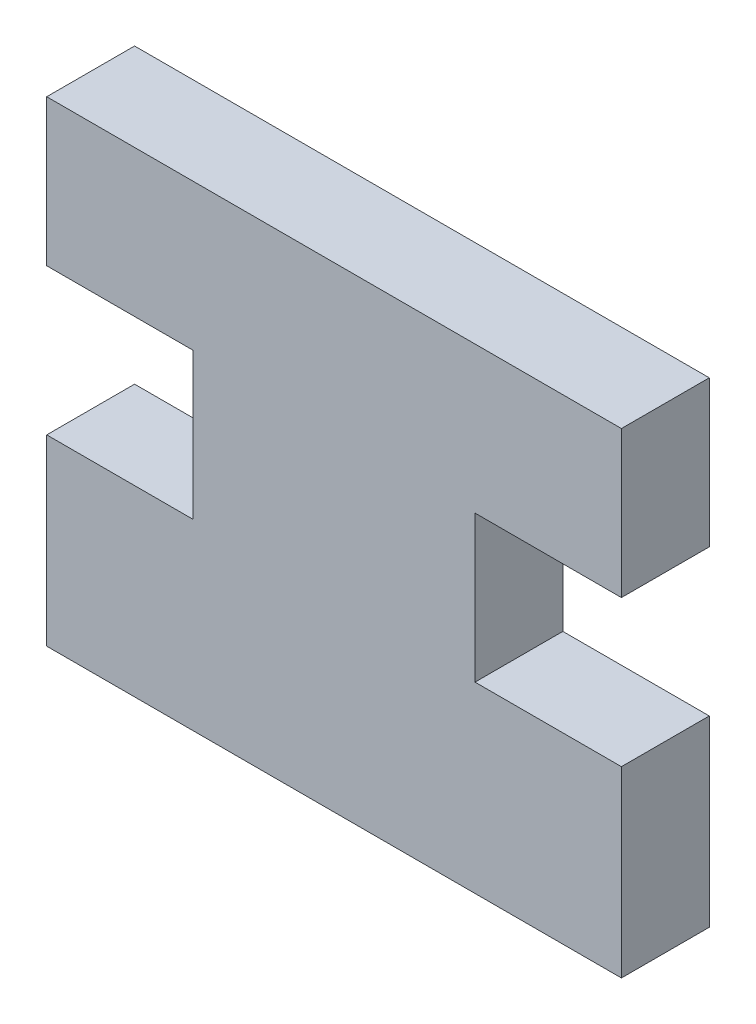
ISO-10303-21;
HEADER;
FILE_DESCRIPTION(('STEP AP214'),'2;1');
FILE_NAME('part.step','',(''),(''),'','','');
FILE_SCHEMA(('AUTOMOTIVE_DESIGN { 1 0 10303 214 1 1 1 1 }'));
ENDSEC;
DATA;
#1=APPLICATION_CONTEXT('core data for automotive mechanical design processes');
#2=APPLICATION_PROTOCOL_DEFINITION('international standard','automotive_design',2000,#1);
#3=PRODUCT_CONTEXT('',#1,'mechanical');
#4=PRODUCT('Part','Part','',(#3));
#5=PRODUCT_RELATED_PRODUCT_CATEGORY('part','',(#4));
#6=PRODUCT_DEFINITION_FORMATION('','',#4);
#7=PRODUCT_DEFINITION_CONTEXT('part definition',#1,'design');
#8=PRODUCT_DEFINITION('design','',#6,#7);
#9=PRODUCT_DEFINITION_SHAPE('','',#8);
#10=(LENGTH_UNIT() NAMED_UNIT(*) SI_UNIT(.MILLI.,.METRE.));
#11=(NAMED_UNIT(*) PLANE_ANGLE_UNIT() SI_UNIT($,.RADIAN.));
#12=(NAMED_UNIT(*) SI_UNIT($,.STERADIAN.) SOLID_ANGLE_UNIT());
#13=UNCERTAINTY_MEASURE_WITH_UNIT(LENGTH_MEASURE(1.E-05),#10,'distance_accuracy_value','');
#14=(GEOMETRIC_REPRESENTATION_CONTEXT(3) GLOBAL_UNCERTAINTY_ASSIGNED_CONTEXT((#13)) GLOBAL_UNIT_ASSIGNED_CONTEXT((#10,
#11,#12)) REPRESENTATION_CONTEXT('',''));
#15=CARTESIAN_POINT('',(0.,0.,0.));
#16=DIRECTION('',(0.,0.,1.));
#17=DIRECTION('',(1.,0.,0.));
#18=AXIS2_PLACEMENT_3D('',#15,#16,#17);
#19=CARTESIAN_POINT('',(1.57,0.,0.24));
#20=DIRECTION('',(0.,1.,0.));
#21=DIRECTION('',(-1.,0.,0.));
#22=AXIS2_PLACEMENT_3D('',#19,#20,#21);
#23=PLANE('',#22);
#24=DIRECTION('',(1.,0.,0.));
#25=VECTOR('',#24,1.);
#26=CARTESIAN_POINT('',(1.57,0.,0.));
#27=LINE('',#26,#25);
#28=CARTESIAN_POINT('',(0.,0.,0.));
#29=VERTEX_POINT('',#28);
#30=CARTESIAN_POINT('',(1.57,0.,0.));
#31=VERTEX_POINT('',#30);
#32=EDGE_CURVE('E163',#29,#31,#27,.T.);
#33=ORIENTED_EDGE('',*,*,#32,.T.);
#34=DIRECTION('',(0.,0.,-1.));
#35=VECTOR('',#34,1.);
#36=CARTESIAN_POINT('',(1.57,0.,0.24));
#37=LINE('',#36,#35);
#38=CARTESIAN_POINT('',(1.57,0.,0.24));
#39=VERTEX_POINT('',#38);
#40=EDGE_CURVE('E11',#39,#31,#37,.T.);
#41=ORIENTED_EDGE('',*,*,#40,.F.);
#42=DIRECTION('',(1.,0.,0.));
#43=VECTOR('',#42,1.);
#44=CARTESIAN_POINT('',(1.57,0.,0.24));
#45=LINE('',#44,#43);
#46=CARTESIAN_POINT('',(0.,0.,0.24));
#47=VERTEX_POINT('',#46);
#48=EDGE_CURVE('E197',#47,#39,#45,.T.);
#49=ORIENTED_EDGE('',*,*,#48,.F.);
#50=DIRECTION('',(0.,0.,-1.));
#51=VECTOR('',#50,1.);
#52=CARTESIAN_POINT('',(0.,0.,0.24));
#53=LINE('',#52,#51);
#54=EDGE_CURVE('E159',#47,#29,#53,.T.);
#55=ORIENTED_EDGE('',*,*,#54,.T.);
#56=EDGE_LOOP('',(#33,#41,#49,#55));
#57=FACE_BOUND('',#56,.T.);
#58=ADVANCED_FACE('F38',(#57),#23,.F.);
#59=CARTESIAN_POINT('',(1.57,0.5,0.24));
#60=DIRECTION('',(-1.,0.,0.));
#61=DIRECTION('',(0.,0.,1.));
#62=AXIS2_PLACEMENT_3D('',#59,#60,#61);
#63=PLANE('',#62);
#64=DIRECTION('',(0.,1.,0.));
#65=VECTOR('',#64,1.);
#66=CARTESIAN_POINT('',(1.57,0.5,0.));
#67=LINE('',#66,#65);
#68=CARTESIAN_POINT('',(1.57,0.5,0.));
#69=VERTEX_POINT('',#68);
#70=EDGE_CURVE('E167',#31,#69,#67,.T.);
#71=ORIENTED_EDGE('',*,*,#70,.T.);
#72=DIRECTION('',(0.,0.,-1.));
#73=VECTOR('',#72,1.);
#74=CARTESIAN_POINT('',(1.57,0.5,0.24));
#75=LINE('',#74,#73);
#76=CARTESIAN_POINT('',(1.57,0.5,0.24));
#77=VERTEX_POINT('',#76);
#78=EDGE_CURVE('E47',#77,#69,#75,.T.);
#79=ORIENTED_EDGE('',*,*,#78,.F.);
#80=DIRECTION('',(0.,1.,0.));
#81=VECTOR('',#80,1.);
#82=CARTESIAN_POINT('',(1.57,0.5,0.24));
#83=LINE('',#82,#81);
#84=EDGE_CURVE('E110',#39,#77,#83,.T.);
#85=ORIENTED_EDGE('',*,*,#84,.F.);
#86=ORIENTED_EDGE('',*,*,#40,.T.);
#87=EDGE_LOOP('',(#71,#79,#85,#86));
#88=FACE_BOUND('',#87,.T.);
#89=ADVANCED_FACE('F291',(#88),#63,.F.);
#90=CARTESIAN_POINT('',(1.17,0.5,0.24));
#91=DIRECTION('',(0.,-1.,0.));
#92=DIRECTION('',(0.,0.,-1.));
#93=AXIS2_PLACEMENT_3D('',#90,#91,#92);
#94=PLANE('',#93);
#95=DIRECTION('',(-1.,0.,0.));
#96=VECTOR('',#95,1.);
#97=CARTESIAN_POINT('',(1.17,0.5,0.));
#98=LINE('',#97,#96);
#99=CARTESIAN_POINT('',(1.17,0.5,0.));
#100=VERTEX_POINT('',#99);
#101=EDGE_CURVE('E170',#69,#100,#98,.T.);
#102=ORIENTED_EDGE('',*,*,#101,.T.);
#103=DIRECTION('',(0.,0.,-1.));
#104=VECTOR('',#103,1.);
#105=CARTESIAN_POINT('',(1.17,0.5,0.24));
#106=LINE('',#105,#104);
#107=CARTESIAN_POINT('',(1.17,0.5,0.24));
#108=VERTEX_POINT('',#107);
#109=EDGE_CURVE('E224',#108,#100,#106,.T.);
#110=ORIENTED_EDGE('',*,*,#109,.F.);
#111=DIRECTION('',(-1.,0.,0.));
#112=VECTOR('',#111,1.);
#113=CARTESIAN_POINT('',(1.17,0.5,0.24));
#114=LINE('',#113,#112);
#115=EDGE_CURVE('E234',#77,#108,#114,.T.);
#116=ORIENTED_EDGE('',*,*,#115,.F.);
#117=ORIENTED_EDGE('',*,*,#78,.T.);
#118=EDGE_LOOP('',(#102,#110,#116,#117));
#119=FACE_BOUND('',#118,.T.);
#120=ADVANCED_FACE('F232',(#119),#94,.F.);
#121=CARTESIAN_POINT('',(1.17,0.9,0.24));
#122=DIRECTION('',(-1.,0.,0.));
#123=DIRECTION('',(0.,0.,1.));
#124=AXIS2_PLACEMENT_3D('',#121,#122,#123);
#125=PLANE('',#124);
#126=DIRECTION('',(0.,1.,0.));
#127=VECTOR('',#126,1.);
#128=CARTESIAN_POINT('',(1.17,0.9,0.));
#129=LINE('',#128,#127);
#130=CARTESIAN_POINT('',(1.17,0.9,0.));
#131=VERTEX_POINT('',#130);
#132=EDGE_CURVE('E173',#100,#131,#129,.T.);
#133=ORIENTED_EDGE('',*,*,#132,.T.);
#134=DIRECTION('',(0.,0.,-1.));
#135=VECTOR('',#134,1.);
#136=CARTESIAN_POINT('',(1.17,0.9,0.24));
#137=LINE('',#136,#135);
#138=CARTESIAN_POINT('',(1.17,0.9,0.24));
#139=VERTEX_POINT('',#138);
#140=EDGE_CURVE('E220',#139,#131,#137,.T.);
#141=ORIENTED_EDGE('',*,*,#140,.F.);
#142=DIRECTION('',(0.,1.,0.));
#143=VECTOR('',#142,1.);
#144=CARTESIAN_POINT('',(1.17,0.9,0.24));
#145=LINE('',#144,#143);
#146=EDGE_CURVE('E253',#108,#139,#145,.T.);
#147=ORIENTED_EDGE('',*,*,#146,.F.);
#148=ORIENTED_EDGE('',*,*,#109,.T.);
#149=EDGE_LOOP('',(#133,#141,#147,#148));
#150=FACE_BOUND('',#149,.T.);
#151=ADVANCED_FACE('F243',(#150),#125,.F.);
#152=CARTESIAN_POINT('',(1.57,0.9,0.24));
#153=DIRECTION('',(0.,1.,0.));
#154=DIRECTION('',(0.,0.,1.));
#155=AXIS2_PLACEMENT_3D('',#152,#153,#154);
#156=PLANE('',#155);
#157=DIRECTION('',(1.,0.,0.));
#158=VECTOR('',#157,1.);
#159=CARTESIAN_POINT('',(1.57,0.9,0.));
#160=LINE('',#159,#158);
#161=CARTESIAN_POINT('',(1.57,0.9,0.));
#162=VERTEX_POINT('',#161);
#163=EDGE_CURVE('E176',#131,#162,#160,.T.);
#164=ORIENTED_EDGE('',*,*,#163,.T.);
#165=DIRECTION('',(0.,0.,-1.));
#166=VECTOR('',#165,1.);
#167=CARTESIAN_POINT('',(1.57,0.9,0.24));
#168=LINE('',#167,#166);
#169=CARTESIAN_POINT('',(1.57,0.9,0.24));
#170=VERTEX_POINT('',#169);
#171=EDGE_CURVE('E216',#170,#162,#168,.T.);
#172=ORIENTED_EDGE('',*,*,#171,.F.);
#173=DIRECTION('',(1.,0.,0.));
#174=VECTOR('',#173,1.);
#175=CARTESIAN_POINT('',(1.57,0.9,0.24));
#176=LINE('',#175,#174);
#177=EDGE_CURVE('E249',#139,#170,#176,.T.);
#178=ORIENTED_EDGE('',*,*,#177,.F.);
#179=ORIENTED_EDGE('',*,*,#140,.T.);
#180=EDGE_LOOP('',(#164,#172,#178,#179));
#181=FACE_BOUND('',#180,.T.);
#182=ADVANCED_FACE('F247',(#181),#156,.F.);
#183=CARTESIAN_POINT('',(1.57,1.3,0.24));
#184=DIRECTION('',(-1.,0.,0.));
#185=DIRECTION('',(0.,0.,1.));
#186=AXIS2_PLACEMENT_3D('',#183,#184,#185);
#187=PLANE('',#186);
#188=DIRECTION('',(0.,1.,0.));
#189=VECTOR('',#188,1.);
#190=CARTESIAN_POINT('',(1.57,1.3,0.));
#191=LINE('',#190,#189);
#192=CARTESIAN_POINT('',(1.57,1.3,0.));
#193=VERTEX_POINT('',#192);
#194=EDGE_CURVE('E179',#162,#193,#191,.T.);
#195=ORIENTED_EDGE('',*,*,#194,.T.);
#196=DIRECTION('',(0.,0.,-1.));
#197=VECTOR('',#196,1.);
#198=CARTESIAN_POINT('',(1.57,1.3,0.24));
#199=LINE('',#198,#197);
#200=CARTESIAN_POINT('',(1.57,1.3,0.24));
#201=VERTEX_POINT('',#200);
#202=EDGE_CURVE('E212',#201,#193,#199,.T.);
#203=ORIENTED_EDGE('',*,*,#202,.F.);
#204=DIRECTION('',(0.,1.,0.));
#205=VECTOR('',#204,1.);
#206=CARTESIAN_POINT('',(1.57,1.3,0.24));
#207=LINE('',#206,#205);
#208=EDGE_CURVE('E252',#170,#201,#207,.T.);
#209=ORIENTED_EDGE('',*,*,#208,.F.);
#210=ORIENTED_EDGE('',*,*,#171,.T.);
#211=EDGE_LOOP('',(#195,#203,#209,#210));
#212=FACE_BOUND('',#211,.T.);
#213=ADVANCED_FACE('F304',(#212),#187,.F.);
#214=CARTESIAN_POINT('',(0.,1.3,0.24));
#215=DIRECTION('',(0.,-1.,0.));
#216=DIRECTION('',(0.,0.,-1.));
#217=AXIS2_PLACEMENT_3D('',#214,#215,#216);
#218=PLANE('',#217);
#219=DIRECTION('',(-1.,0.,0.));
#220=VECTOR('',#219,1.);
#221=CARTESIAN_POINT('',(0.,1.3,0.));
#222=LINE('',#221,#220);
#223=CARTESIAN_POINT('',(0.,1.3,0.));
#224=VERTEX_POINT('',#223);
#225=EDGE_CURVE('E182',#193,#224,#222,.T.);
#226=ORIENTED_EDGE('',*,*,#225,.T.);
#227=DIRECTION('',(0.,0.,-1.));
#228=VECTOR('',#227,1.);
#229=CARTESIAN_POINT('',(0.,1.3,0.24));
#230=LINE('',#229,#228);
#231=CARTESIAN_POINT('',(0.,1.3,0.24));
#232=VERTEX_POINT('',#231);
#233=EDGE_CURVE('E208',#232,#224,#230,.T.);
#234=ORIENTED_EDGE('',*,*,#233,.F.);
#235=DIRECTION('',(-1.,0.,0.));
#236=VECTOR('',#235,1.);
#237=CARTESIAN_POINT('',(0.,1.3,0.24));
#238=LINE('',#237,#236);
#239=EDGE_CURVE('E257',#201,#232,#238,.T.);
#240=ORIENTED_EDGE('',*,*,#239,.F.);
#241=ORIENTED_EDGE('',*,*,#202,.T.);
#242=EDGE_LOOP('',(#226,#234,#240,#241));
#243=FACE_BOUND('',#242,.T.);
#244=ADVANCED_FACE('F307',(#243),#218,.F.);
#245=CARTESIAN_POINT('',(0.,0.9,0.24));
#246=DIRECTION('',(1.,0.,0.));
#247=DIRECTION('',(0.,0.,-1.));
#248=AXIS2_PLACEMENT_3D('',#245,#246,#247);
#249=PLANE('',#248);
#250=DIRECTION('',(0.,-1.,0.));
#251=VECTOR('',#250,1.);
#252=CARTESIAN_POINT('',(0.,0.9,0.));
#253=LINE('',#252,#251);
#254=CARTESIAN_POINT('',(0.,0.9,0.));
#255=VERTEX_POINT('',#254);
#256=EDGE_CURVE('E185',#224,#255,#253,.T.);
#257=ORIENTED_EDGE('',*,*,#256,.T.);
#258=DIRECTION('',(0.,0.,-1.));
#259=VECTOR('',#258,1.);
#260=CARTESIAN_POINT('',(0.,0.9,0.24));
#261=LINE('',#260,#259);
#262=CARTESIAN_POINT('',(0.,0.9,0.24));
#263=VERTEX_POINT('',#262);
#264=EDGE_CURVE('E204',#263,#255,#261,.T.);
#265=ORIENTED_EDGE('',*,*,#264,.F.);
#266=DIRECTION('',(0.,-1.,0.));
#267=VECTOR('',#266,1.);
#268=CARTESIAN_POINT('',(0.,0.9,0.24));
#269=LINE('',#268,#267);
#270=EDGE_CURVE('E264',#232,#263,#269,.T.);
#271=ORIENTED_EDGE('',*,*,#270,.F.);
#272=ORIENTED_EDGE('',*,*,#233,.T.);
#273=EDGE_LOOP('',(#257,#265,#271,#272));
#274=FACE_BOUND('',#273,.T.);
#275=ADVANCED_FACE('F272',(#274),#249,.F.);
#276=CARTESIAN_POINT('',(0.4,0.9,0.24));
#277=DIRECTION('',(0.,1.,0.));
#278=DIRECTION('',(-1.,0.,0.));
#279=AXIS2_PLACEMENT_3D('',#276,#277,#278);
#280=PLANE('',#279);
#281=DIRECTION('',(1.,0.,0.));
#282=VECTOR('',#281,1.);
#283=CARTESIAN_POINT('',(0.4,0.9,0.));
#284=LINE('',#283,#282);
#285=CARTESIAN_POINT('',(0.4,0.9,0.));
#286=VERTEX_POINT('',#285);
#287=EDGE_CURVE('E188',#255,#286,#284,.T.);
#288=ORIENTED_EDGE('',*,*,#287,.T.);
#289=DIRECTION('',(0.,0.,-1.));
#290=VECTOR('',#289,1.);
#291=CARTESIAN_POINT('',(0.4,0.9,0.24));
#292=LINE('',#291,#290);
#293=CARTESIAN_POINT('',(0.4,0.9,0.24));
#294=VERTEX_POINT('',#293);
#295=EDGE_CURVE('E152',#294,#286,#292,.T.);
#296=ORIENTED_EDGE('',*,*,#295,.F.);
#297=DIRECTION('',(1.,0.,0.));
#298=VECTOR('',#297,1.);
#299=CARTESIAN_POINT('',(0.4,0.9,0.24));
#300=LINE('',#299,#298);
#301=EDGE_CURVE('E141',#263,#294,#300,.T.);
#302=ORIENTED_EDGE('',*,*,#301,.F.);
#303=ORIENTED_EDGE('',*,*,#264,.T.);
#304=EDGE_LOOP('',(#288,#296,#302,#303));
#305=FACE_BOUND('',#304,.T.);
#306=ADVANCED_FACE('F276',(#305),#280,.F.);
#307=CARTESIAN_POINT('',(0.4,0.5,0.24));
#308=DIRECTION('',(1.,0.,0.));
#309=DIRECTION('',(0.,1.,0.));
#310=AXIS2_PLACEMENT_3D('',#307,#308,#309);
#311=PLANE('',#310);
#312=DIRECTION('',(0.,-1.,0.));
#313=VECTOR('',#312,1.);
#314=CARTESIAN_POINT('',(0.4,0.5,0.));
#315=LINE('',#314,#313);
#316=CARTESIAN_POINT('',(0.4,0.5,0.));
#317=VERTEX_POINT('',#316);
#318=EDGE_CURVE('E150',#286,#317,#315,.T.);
#319=ORIENTED_EDGE('',*,*,#318,.T.);
#320=DIRECTION('',(0.,0.,-1.));
#321=VECTOR('',#320,1.);
#322=CARTESIAN_POINT('',(0.4,0.5,0.24));
#323=LINE('',#322,#321);
#324=CARTESIAN_POINT('',(0.4,0.5,0.24));
#325=VERTEX_POINT('',#324);
#326=EDGE_CURVE('E147',#325,#317,#323,.T.);
#327=ORIENTED_EDGE('',*,*,#326,.F.);
#328=DIRECTION('',(0.,-1.,0.));
#329=VECTOR('',#328,1.);
#330=CARTESIAN_POINT('',(0.4,0.5,0.24));
#331=LINE('',#330,#329);
#332=EDGE_CURVE('E135',#294,#325,#331,.T.);
#333=ORIENTED_EDGE('',*,*,#332,.F.);
#334=ORIENTED_EDGE('',*,*,#295,.T.);
#335=EDGE_LOOP('',(#319,#327,#333,#334));
#336=FACE_BOUND('',#335,.T.);
#337=ADVANCED_FACE('F148',(#336),#311,.F.);
#338=CARTESIAN_POINT('',(0.,0.5,0.24));
#339=DIRECTION('',(0.,-1.,0.));
#340=DIRECTION('',(0.,0.,-1.));
#341=AXIS2_PLACEMENT_3D('',#338,#339,#340);
#342=PLANE('',#341);
#343=DIRECTION('',(-1.,0.,0.));
#344=VECTOR('',#343,1.);
#345=CARTESIAN_POINT('',(0.,0.5,0.));
#346=LINE('',#345,#344);
#347=CARTESIAN_POINT('',(0.,0.5,0.));
#348=VERTEX_POINT('',#347);
#349=EDGE_CURVE('E96',#317,#348,#346,.T.);
#350=ORIENTED_EDGE('',*,*,#349,.T.);
#351=DIRECTION('',(0.,0.,-1.));
#352=VECTOR('',#351,1.);
#353=CARTESIAN_POINT('',(0.,0.5,0.24));
#354=LINE('',#353,#352);
#355=CARTESIAN_POINT('',(0.,0.5,0.24));
#356=VERTEX_POINT('',#355);
#357=EDGE_CURVE('E153',#356,#348,#354,.T.);
#358=ORIENTED_EDGE('',*,*,#357,.F.);
#359=DIRECTION('',(-1.,0.,0.));
#360=VECTOR('',#359,1.);
#361=CARTESIAN_POINT('',(0.,0.5,0.24));
#362=LINE('',#361,#360);
#363=EDGE_CURVE('E139',#325,#356,#362,.T.);
#364=ORIENTED_EDGE('',*,*,#363,.F.);
#365=ORIENTED_EDGE('',*,*,#326,.T.);
#366=EDGE_LOOP('',(#350,#358,#364,#365));
#367=FACE_BOUND('',#366,.T.);
#368=ADVANCED_FACE('F155',(#367),#342,.F.);
#369=CARTESIAN_POINT('',(0.,0.,0.24));
#370=DIRECTION('',(1.,0.,0.));
#371=DIRECTION('',(0.,0.,-1.));
#372=AXIS2_PLACEMENT_3D('',#369,#370,#371);
#373=PLANE('',#372);
#374=DIRECTION('',(0.,-1.,0.));
#375=VECTOR('',#374,1.);
#376=CARTESIAN_POINT('',(0.,0.,0.));
#377=LINE('',#376,#375);
#378=EDGE_CURVE('E102',#348,#29,#377,.T.);
#379=ORIENTED_EDGE('',*,*,#378,.T.);
#380=ORIENTED_EDGE('',*,*,#54,.F.);
#381=DIRECTION('',(0.,-1.,0.));
#382=VECTOR('',#381,1.);
#383=CARTESIAN_POINT('',(0.,0.,0.24));
#384=LINE('',#383,#382);
#385=EDGE_CURVE('E55',#356,#47,#384,.T.);
#386=ORIENTED_EDGE('',*,*,#385,.F.);
#387=ORIENTED_EDGE('',*,*,#357,.T.);
#388=EDGE_LOOP('',(#379,#380,#386,#387));
#389=FACE_BOUND('',#388,.T.);
#390=ADVANCED_FACE('F280',(#389),#373,.F.);
#391=CARTESIAN_POINT('',(0.,0.,0.24));
#392=DIRECTION('',(0.,0.,-1.));
#393=DIRECTION('',(-1.,0.,0.));
#394=AXIS2_PLACEMENT_3D('',#391,#392,#393);
#395=PLANE('',#394);
#396=ORIENTED_EDGE('',*,*,#48,.T.);
#397=ORIENTED_EDGE('',*,*,#84,.T.);
#398=ORIENTED_EDGE('',*,*,#115,.T.);
#399=ORIENTED_EDGE('',*,*,#146,.T.);
#400=ORIENTED_EDGE('',*,*,#177,.T.);
#401=ORIENTED_EDGE('',*,*,#208,.T.);
#402=ORIENTED_EDGE('',*,*,#239,.T.);
#403=ORIENTED_EDGE('',*,*,#270,.T.);
#404=ORIENTED_EDGE('',*,*,#301,.T.);
#405=ORIENTED_EDGE('',*,*,#332,.T.);
#406=ORIENTED_EDGE('',*,*,#363,.T.);
#407=ORIENTED_EDGE('',*,*,#385,.T.);
#408=EDGE_LOOP('',(#396,#397,#398,#399,#400,#401,#402,#403,#404,#405,#406,#407));
#409=FACE_BOUND('',#408,.T.);
#410=ADVANCED_FACE('F137',(#409),#395,.F.);
#411=CARTESIAN_POINT('',(0.,0.,0.));
#412=DIRECTION('',(0.,0.,-1.));
#413=DIRECTION('',(-1.,0.,0.));
#414=AXIS2_PLACEMENT_3D('',#411,#412,#413);
#415=PLANE('',#414);
#416=ORIENTED_EDGE('',*,*,#32,.F.);
#417=ORIENTED_EDGE('',*,*,#378,.F.);
#418=ORIENTED_EDGE('',*,*,#349,.F.);
#419=ORIENTED_EDGE('',*,*,#318,.F.);
#420=ORIENTED_EDGE('',*,*,#287,.F.);
#421=ORIENTED_EDGE('',*,*,#256,.F.);
#422=ORIENTED_EDGE('',*,*,#225,.F.);
#423=ORIENTED_EDGE('',*,*,#194,.F.);
#424=ORIENTED_EDGE('',*,*,#163,.F.);
#425=ORIENTED_EDGE('',*,*,#132,.F.);
#426=ORIENTED_EDGE('',*,*,#101,.F.);
#427=ORIENTED_EDGE('',*,*,#70,.F.);
#428=EDGE_LOOP('',(#416,#417,#418,#419,#420,#421,#422,#423,#424,#425,#426,#427));
#429=FACE_BOUND('',#428,.T.);
#430=ADVANCED_FACE('F238',(#429),#415,.T.);
#431=CLOSED_SHELL('',(#58,#89,#120,#151,#182,#213,#244,#275,#306,#337,#368,#390,#410,#430));
#432=MANIFOLD_SOLID_BREP('B2',#431);
#433=ADVANCED_BREP_SHAPE_REPRESENTATION('',(#18,#432),#14);
#434=SHAPE_DEFINITION_REPRESENTATION(#9,#433);
ENDSEC;
END-ISO-10303-21;
